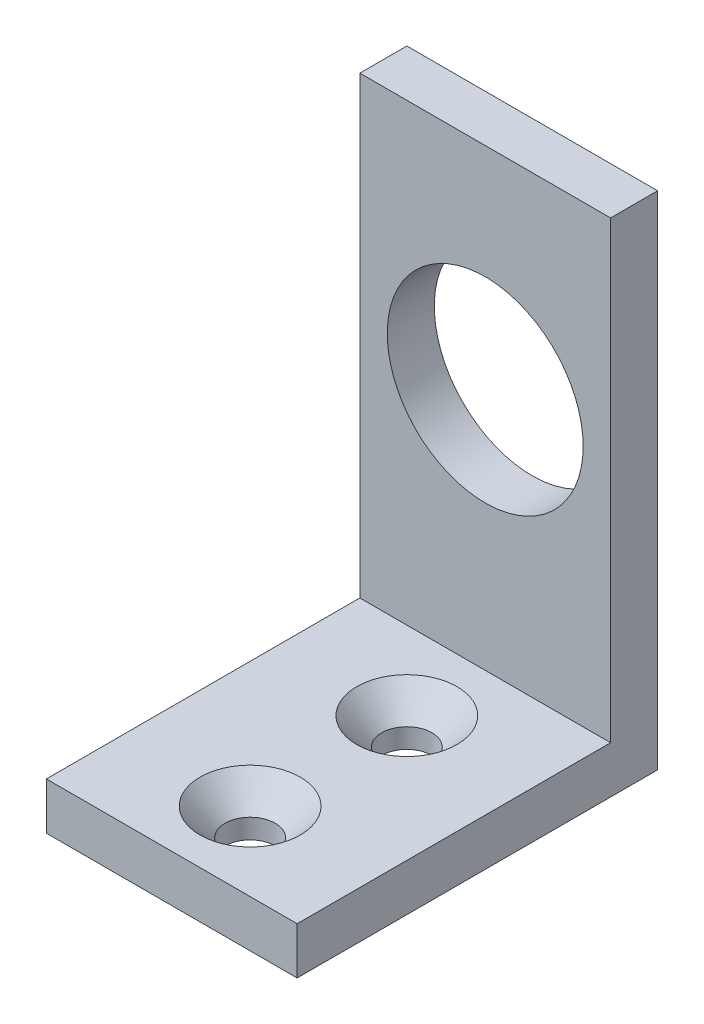
ISO-10303-21;
HEADER;
FILE_DESCRIPTION(('STEP AP214'),'2;1');
FILE_NAME('part.step','',(''),(''),'','','');
FILE_SCHEMA(('AUTOMOTIVE_DESIGN { 1 0 10303 214 1 1 1 1 }'));
ENDSEC;
DATA;
#1=APPLICATION_CONTEXT('core data for automotive mechanical design processes');
#2=APPLICATION_PROTOCOL_DEFINITION('international standard','automotive_design',2000,#1);
#3=PRODUCT_CONTEXT('',#1,'mechanical');
#4=PRODUCT('Part','Part','',(#3));
#5=PRODUCT_RELATED_PRODUCT_CATEGORY('part','',(#4));
#6=PRODUCT_DEFINITION_FORMATION('','',#4);
#7=PRODUCT_DEFINITION_CONTEXT('part definition',#1,'design');
#8=PRODUCT_DEFINITION('design','',#6,#7);
#9=PRODUCT_DEFINITION_SHAPE('','',#8);
#10=(LENGTH_UNIT() NAMED_UNIT(*) SI_UNIT(.MILLI.,.METRE.));
#11=(NAMED_UNIT(*) PLANE_ANGLE_UNIT() SI_UNIT($,.RADIAN.));
#12=(NAMED_UNIT(*) SI_UNIT($,.STERADIAN.) SOLID_ANGLE_UNIT());
#13=UNCERTAINTY_MEASURE_WITH_UNIT(LENGTH_MEASURE(1.E-05),#10,'distance_accuracy_value','');
#14=(GEOMETRIC_REPRESENTATION_CONTEXT(3) GLOBAL_UNCERTAINTY_ASSIGNED_CONTEXT((#13)) GLOBAL_UNIT_ASSIGNED_CONTEXT((#10,
#11,#12)) REPRESENTATION_CONTEXT('',''));
#15=CARTESIAN_POINT('',(0.,0.,0.));
#16=DIRECTION('',(0.,0.,1.));
#17=DIRECTION('',(1.,0.,0.));
#18=AXIS2_PLACEMENT_3D('',#15,#16,#17);
#19=CARTESIAN_POINT('',(16.,0.,-23.));
#20=DIRECTION('',(0.,0.,-1.));
#21=DIRECTION('',(-1.,0.,0.));
#22=AXIS2_PLACEMENT_3D('',#19,#20,#21);
#23=PLANE('',#22);
#24=CARTESIAN_POINT('',(7.99999999999999,15.5,-23.));
#25=DIRECTION('',(0.,0.,1.));
#26=DIRECTION('',(1.,0.,0.));
#27=AXIS2_PLACEMENT_3D('',#24,#25,#26);
#28=CIRCLE('',#27,6.25);
#29=CARTESIAN_POINT('',(14.25,15.5,-23.));
#30=VERTEX_POINT('',#29);
#31=EDGE_CURVE('E194',#30,#30,#28,.T.);
#32=ORIENTED_EDGE('',*,*,#31,.T.);
#33=EDGE_LOOP('',(#32));
#34=FACE_BOUND('',#33,.T.);
#35=DIRECTION('',(0.,-1.,0.));
#36=VECTOR('',#35,1.);
#37=CARTESIAN_POINT('',(0.,0.,-23.));
#38=LINE('',#37,#36);
#39=CARTESIAN_POINT('',(0.,29.,-23.));
#40=VERTEX_POINT('',#39);
#41=CARTESIAN_POINT('',(0.,-3.,-23.));
#42=VERTEX_POINT('',#41);
#43=EDGE_CURVE('E129',#40,#42,#38,.T.);
#44=ORIENTED_EDGE('',*,*,#43,.F.);
#45=DIRECTION('',(-1.,0.,0.));
#46=VECTOR('',#45,1.);
#47=CARTESIAN_POINT('',(16.,29.,-23.));
#48=LINE('',#47,#46);
#49=CARTESIAN_POINT('',(16.,29.,-23.));
#50=VERTEX_POINT('',#49);
#51=EDGE_CURVE('E11',#50,#40,#48,.T.);
#52=ORIENTED_EDGE('',*,*,#51,.F.);
#53=DIRECTION('',(0.,-1.,0.));
#54=VECTOR('',#53,1.);
#55=CARTESIAN_POINT('',(16.,0.,-23.));
#56=LINE('',#55,#54);
#57=CARTESIAN_POINT('',(16.,-3.,-23.));
#58=VERTEX_POINT('',#57);
#59=EDGE_CURVE('E148',#50,#58,#56,.T.);
#60=ORIENTED_EDGE('',*,*,#59,.T.);
#61=DIRECTION('',(-1.,0.,0.));
#62=VECTOR('',#61,1.);
#63=CARTESIAN_POINT('',(16.,-3.,-23.));
#64=LINE('',#63,#62);
#65=EDGE_CURVE('E86',#58,#42,#64,.T.);
#66=ORIENTED_EDGE('',*,*,#65,.T.);
#67=EDGE_LOOP('',(#44,#52,#60,#66));
#68=FACE_BOUND('',#67,.T.);
#69=ADVANCED_FACE('F41',(#34,#68),#23,.T.);
#70=CARTESIAN_POINT('',(16.,29.,0.));
#71=DIRECTION('',(0.,-1.,0.));
#72=DIRECTION('',(0.,0.,-1.));
#73=AXIS2_PLACEMENT_3D('',#70,#71,#72);
#74=PLANE('',#73);
#75=DIRECTION('',(0.,0.,1.));
#76=VECTOR('',#75,1.);
#77=CARTESIAN_POINT('',(0.,29.,0.));
#78=LINE('',#77,#76);
#79=CARTESIAN_POINT('',(0.,29.,-20.));
#80=VERTEX_POINT('',#79);
#81=EDGE_CURVE('E133',#40,#80,#78,.T.);
#82=ORIENTED_EDGE('',*,*,#81,.T.);
#83=DIRECTION('',(-1.,0.,0.));
#84=VECTOR('',#83,1.);
#85=CARTESIAN_POINT('',(16.,29.,-20.));
#86=LINE('',#85,#84);
#87=CARTESIAN_POINT('',(16.,29.,-20.));
#88=VERTEX_POINT('',#87);
#89=EDGE_CURVE('E50',#88,#80,#86,.T.);
#90=ORIENTED_EDGE('',*,*,#89,.F.);
#91=DIRECTION('',(0.,0.,1.));
#92=VECTOR('',#91,1.);
#93=CARTESIAN_POINT('',(16.,29.,0.));
#94=LINE('',#93,#92);
#95=EDGE_CURVE('E123',#50,#88,#94,.T.);
#96=ORIENTED_EDGE('',*,*,#95,.F.);
#97=ORIENTED_EDGE('',*,*,#51,.T.);
#98=EDGE_LOOP('',(#82,#90,#96,#97));
#99=FACE_BOUND('',#98,.T.);
#100=ADVANCED_FACE('F212',(#99),#74,.F.);
#101=CARTESIAN_POINT('',(16.,0.,-20.));
#102=DIRECTION('',(0.,0.,-1.));
#103=DIRECTION('',(0.,1.,0.));
#104=AXIS2_PLACEMENT_3D('',#101,#102,#103);
#105=PLANE('',#104);
#106=CARTESIAN_POINT('',(7.99999999999999,15.5,-20.));
#107=DIRECTION('',(0.,0.,1.));
#108=DIRECTION('',(1.,0.,0.));
#109=AXIS2_PLACEMENT_3D('',#106,#107,#108);
#110=CIRCLE('',#109,6.25);
#111=CARTESIAN_POINT('',(14.25,15.5,-20.));
#112=VERTEX_POINT('',#111);
#113=EDGE_CURVE('E195',#112,#112,#110,.T.);
#114=ORIENTED_EDGE('',*,*,#113,.F.);
#115=EDGE_LOOP('',(#114));
#116=FACE_BOUND('',#115,.T.);
#117=DIRECTION('',(0.,-1.,0.));
#118=VECTOR('',#117,1.);
#119=CARTESIAN_POINT('',(0.,0.,-20.));
#120=LINE('',#119,#118);
#121=CARTESIAN_POINT('',(0.,0.,-20.));
#122=VERTEX_POINT('',#121);
#123=EDGE_CURVE('E137',#80,#122,#120,.T.);
#124=ORIENTED_EDGE('',*,*,#123,.T.);
#125=DIRECTION('',(-1.,0.,0.));
#126=VECTOR('',#125,1.);
#127=CARTESIAN_POINT('',(16.,0.,-20.));
#128=LINE('',#127,#126);
#129=CARTESIAN_POINT('',(16.,0.,-20.));
#130=VERTEX_POINT('',#129);
#131=EDGE_CURVE('E109',#130,#122,#128,.T.);
#132=ORIENTED_EDGE('',*,*,#131,.F.);
#133=DIRECTION('',(0.,-1.,0.));
#134=VECTOR('',#133,1.);
#135=CARTESIAN_POINT('',(16.,0.,-20.));
#136=LINE('',#135,#134);
#137=EDGE_CURVE('E118',#88,#130,#136,.T.);
#138=ORIENTED_EDGE('',*,*,#137,.F.);
#139=ORIENTED_EDGE('',*,*,#89,.T.);
#140=EDGE_LOOP('',(#124,#132,#138,#139));
#141=FACE_BOUND('',#140,.T.);
#142=ADVANCED_FACE('F159',(#116,#141),#105,.F.);
#143=CARTESIAN_POINT('',(16.,0.,0.));
#144=DIRECTION('',(0.,1.,0.));
#145=DIRECTION('',(0.,0.,1.));
#146=AXIS2_PLACEMENT_3D('',#143,#144,#145);
#147=PLANE('',#146);
#148=CARTESIAN_POINT('',(8.,0.,-5.));
#149=DIRECTION('',(0.,1.,0.));
#150=DIRECTION('',(0.,0.,1.));
#151=AXIS2_PLACEMENT_3D('',#148,#149,#150);
#152=CIRCLE('',#151,3.2);
#153=CARTESIAN_POINT('',(8.,0.,-1.8));
#154=VERTEX_POINT('',#153);
#155=EDGE_CURVE('E190',#154,#154,#152,.T.);
#156=ORIENTED_EDGE('',*,*,#155,.F.);
#157=EDGE_LOOP('',(#156));
#158=FACE_BOUND('',#157,.T.);
#159=CARTESIAN_POINT('',(8.,0.,-15.));
#160=DIRECTION('',(0.,1.,0.));
#161=DIRECTION('',(0.,0.,1.));
#162=AXIS2_PLACEMENT_3D('',#159,#160,#161);
#163=CIRCLE('',#162,3.2);
#164=CARTESIAN_POINT('',(8.,0.,-11.8));
#165=VERTEX_POINT('',#164);
#166=EDGE_CURVE('E178',#165,#165,#163,.T.);
#167=ORIENTED_EDGE('',*,*,#166,.F.);
#168=EDGE_LOOP('',(#167));
#169=FACE_BOUND('',#168,.T.);
#170=DIRECTION('',(0.,0.,-1.));
#171=VECTOR('',#170,1.);
#172=CARTESIAN_POINT('',(0.,0.,0.));
#173=LINE('',#172,#171);
#174=CARTESIAN_POINT('',(0.,0.,0.));
#175=VERTEX_POINT('',#174);
#176=EDGE_CURVE('E107',#175,#122,#173,.T.);
#177=ORIENTED_EDGE('',*,*,#176,.F.);
#178=DIRECTION('',(-1.,0.,0.));
#179=VECTOR('',#178,1.);
#180=CARTESIAN_POINT('',(16.,0.,0.));
#181=LINE('',#180,#179);
#182=CARTESIAN_POINT('',(16.,0.,0.));
#183=VERTEX_POINT('',#182);
#184=EDGE_CURVE('E101',#183,#175,#181,.T.);
#185=ORIENTED_EDGE('',*,*,#184,.F.);
#186=DIRECTION('',(0.,0.,-1.));
#187=VECTOR('',#186,1.);
#188=CARTESIAN_POINT('',(16.,0.,0.));
#189=LINE('',#188,#187);
#190=EDGE_CURVE('E105',#183,#130,#189,.T.);
#191=ORIENTED_EDGE('',*,*,#190,.T.);
#192=ORIENTED_EDGE('',*,*,#131,.T.);
#193=EDGE_LOOP('',(#177,#185,#191,#192));
#194=FACE_BOUND('',#193,.T.);
#195=ADVANCED_FACE('F103',(#158,#169,#194),#147,.T.);
#196=CARTESIAN_POINT('',(16.,0.,0.));
#197=DIRECTION('',(0.,0.,-1.));
#198=DIRECTION('',(0.,1.,0.));
#199=AXIS2_PLACEMENT_3D('',#196,#197,#198);
#200=PLANE('',#199);
#201=DIRECTION('',(0.,-1.,0.));
#202=VECTOR('',#201,1.);
#203=CARTESIAN_POINT('',(0.,0.,0.));
#204=LINE('',#203,#202);
#205=CARTESIAN_POINT('',(0.,-3.,0.));
#206=VERTEX_POINT('',#205);
#207=EDGE_CURVE('E79',#175,#206,#204,.T.);
#208=ORIENTED_EDGE('',*,*,#207,.T.);
#209=DIRECTION('',(-1.,0.,0.));
#210=VECTOR('',#209,1.);
#211=CARTESIAN_POINT('',(16.,-3.,0.));
#212=LINE('',#211,#210);
#213=CARTESIAN_POINT('',(16.,-3.,0.));
#214=VERTEX_POINT('',#213);
#215=EDGE_CURVE('E110',#214,#206,#212,.T.);
#216=ORIENTED_EDGE('',*,*,#215,.F.);
#217=DIRECTION('',(0.,-1.,0.));
#218=VECTOR('',#217,1.);
#219=CARTESIAN_POINT('',(16.,0.,0.));
#220=LINE('',#219,#218);
#221=EDGE_CURVE('E112',#183,#214,#220,.T.);
#222=ORIENTED_EDGE('',*,*,#221,.F.);
#223=ORIENTED_EDGE('',*,*,#184,.T.);
#224=EDGE_LOOP('',(#208,#216,#222,#223));
#225=FACE_BOUND('',#224,.T.);
#226=ADVANCED_FACE('F113',(#225),#200,.F.);
#227=CARTESIAN_POINT('',(16.,-3.,0.));
#228=DIRECTION('',(0.,1.,0.));
#229=DIRECTION('',(0.,0.,1.));
#230=AXIS2_PLACEMENT_3D('',#227,#228,#229);
#231=PLANE('',#230);
#232=CARTESIAN_POINT('',(8.,-3.,-5.));
#233=DIRECTION('',(0.,1.,0.));
#234=DIRECTION('',(0.,0.,1.));
#235=AXIS2_PLACEMENT_3D('',#232,#233,#234);
#236=CIRCLE('',#235,1.6);
#237=CARTESIAN_POINT('',(8.,-3.,-3.4));
#238=VERTEX_POINT('',#237);
#239=EDGE_CURVE('E182',#238,#238,#236,.T.);
#240=ORIENTED_EDGE('',*,*,#239,.T.);
#241=EDGE_LOOP('',(#240));
#242=FACE_BOUND('',#241,.T.);
#243=CARTESIAN_POINT('',(8.,-3.,-15.));
#244=DIRECTION('',(0.,1.,0.));
#245=DIRECTION('',(0.,0.,1.));
#246=AXIS2_PLACEMENT_3D('',#243,#244,#245);
#247=CIRCLE('',#246,1.6);
#248=CARTESIAN_POINT('',(8.,-3.,-13.4));
#249=VERTEX_POINT('',#248);
#250=EDGE_CURVE('E134',#249,#249,#247,.T.);
#251=ORIENTED_EDGE('',*,*,#250,.T.);
#252=EDGE_LOOP('',(#251));
#253=FACE_BOUND('',#252,.T.);
#254=DIRECTION('',(0.,0.,-1.));
#255=VECTOR('',#254,1.);
#256=CARTESIAN_POINT('',(0.,-3.,0.));
#257=LINE('',#256,#255);
#258=EDGE_CURVE('E145',#206,#42,#257,.T.);
#259=ORIENTED_EDGE('',*,*,#258,.T.);
#260=ORIENTED_EDGE('',*,*,#65,.F.);
#261=DIRECTION('',(0.,0.,-1.));
#262=VECTOR('',#261,1.);
#263=CARTESIAN_POINT('',(16.,-3.,0.));
#264=LINE('',#263,#262);
#265=EDGE_CURVE('E58',#214,#58,#264,.T.);
#266=ORIENTED_EDGE('',*,*,#265,.F.);
#267=ORIENTED_EDGE('',*,*,#215,.T.);
#268=EDGE_LOOP('',(#259,#260,#266,#267));
#269=FACE_BOUND('',#268,.T.);
#270=ADVANCED_FACE('F166',(#242,#253,#269),#231,.F.);
#271=CARTESIAN_POINT('',(16.,0.,0.));
#272=DIRECTION('',(1.,0.,0.));
#273=DIRECTION('',(0.,0.,-1.));
#274=AXIS2_PLACEMENT_3D('',#271,#272,#273);
#275=PLANE('',#274);
#276=ORIENTED_EDGE('',*,*,#59,.F.);
#277=ORIENTED_EDGE('',*,*,#95,.T.);
#278=ORIENTED_EDGE('',*,*,#137,.T.);
#279=ORIENTED_EDGE('',*,*,#190,.F.);
#280=ORIENTED_EDGE('',*,*,#221,.T.);
#281=ORIENTED_EDGE('',*,*,#265,.T.);
#282=EDGE_LOOP('',(#276,#277,#278,#279,#280,#281));
#283=FACE_BOUND('',#282,.T.);
#284=ADVANCED_FACE('F116',(#283),#275,.T.);
#285=CARTESIAN_POINT('',(0.,0.,0.));
#286=DIRECTION('',(1.,0.,0.));
#287=DIRECTION('',(0.,0.,-1.));
#288=AXIS2_PLACEMENT_3D('',#285,#286,#287);
#289=PLANE('',#288);
#290=ORIENTED_EDGE('',*,*,#43,.T.);
#291=ORIENTED_EDGE('',*,*,#258,.F.);
#292=ORIENTED_EDGE('',*,*,#207,.F.);
#293=ORIENTED_EDGE('',*,*,#176,.T.);
#294=ORIENTED_EDGE('',*,*,#123,.F.);
#295=ORIENTED_EDGE('',*,*,#81,.F.);
#296=EDGE_LOOP('',(#290,#291,#292,#293,#294,#295));
#297=FACE_BOUND('',#296,.T.);
#298=ADVANCED_FACE('F163',(#297),#289,.F.);
#299=CARTESIAN_POINT('',(8.,0.,-15.));
#300=DIRECTION('',(0.,1.,0.));
#301=DIRECTION('',(0.,0.,1.));
#302=AXIS2_PLACEMENT_3D('',#299,#300,#301);
#303=CYLINDRICAL_SURFACE('',#302,1.6);
#304=ORIENTED_EDGE('',*,*,#250,.F.);
#305=EDGE_LOOP('',(#304));
#306=FACE_BOUND('',#305,.T.);
#307=CARTESIAN_POINT('',(8.,-1.74609360171083,-15.));
#308=DIRECTION('',(0.,1.,0.));
#309=DIRECTION('',(0.,0.,1.));
#310=AXIS2_PLACEMENT_3D('',#307,#308,#309);
#311=CIRCLE('',#310,1.6);
#312=CARTESIAN_POINT('',(8.,-1.74609360171083,-13.4));
#313=VERTEX_POINT('',#312);
#314=EDGE_CURVE('E174',#313,#313,#311,.T.);
#315=ORIENTED_EDGE('',*,*,#314,.T.);
#316=EDGE_LOOP('',(#315));
#317=FACE_BOUND('',#316,.T.);
#318=ADVANCED_FACE('F259',(#306,#317),#303,.F.);
#319=CARTESIAN_POINT('',(8.,0.,-15.));
#320=DIRECTION('',(0.,1.,0.));
#321=DIRECTION('',(0.,0.,1.));
#322=AXIS2_PLACEMENT_3D('',#319,#320,#321);
#323=CONICAL_SURFACE('',#322,3.2,0.741764932097591);
#324=ORIENTED_EDGE('',*,*,#314,.F.);
#325=EDGE_LOOP('',(#324));
#326=FACE_BOUND('',#325,.T.);
#327=ORIENTED_EDGE('',*,*,#166,.T.);
#328=EDGE_LOOP('',(#327));
#329=FACE_BOUND('',#328,.T.);
#330=ADVANCED_FACE('F280',(#326,#329),#323,.F.);
#331=CARTESIAN_POINT('',(8.,0.,-5.));
#332=DIRECTION('',(0.,1.,0.));
#333=DIRECTION('',(0.,0.,1.));
#334=AXIS2_PLACEMENT_3D('',#331,#332,#333);
#335=CYLINDRICAL_SURFACE('',#334,1.6);
#336=ORIENTED_EDGE('',*,*,#239,.F.);
#337=EDGE_LOOP('',(#336));
#338=FACE_BOUND('',#337,.T.);
#339=CARTESIAN_POINT('',(8.,-1.74609360171083,-5.));
#340=DIRECTION('',(0.,1.,0.));
#341=DIRECTION('',(0.,0.,1.));
#342=AXIS2_PLACEMENT_3D('',#339,#340,#341);
#343=CIRCLE('',#342,1.6);
#344=CARTESIAN_POINT('',(8.,-1.74609360171083,-3.4));
#345=VERTEX_POINT('',#344);
#346=EDGE_CURVE('E186',#345,#345,#343,.T.);
#347=ORIENTED_EDGE('',*,*,#346,.T.);
#348=EDGE_LOOP('',(#347));
#349=FACE_BOUND('',#348,.T.);
#350=ADVANCED_FACE('F290',(#338,#349),#335,.F.);
#351=CARTESIAN_POINT('',(8.,0.,-5.));
#352=DIRECTION('',(0.,1.,0.));
#353=DIRECTION('',(0.,0.,1.));
#354=AXIS2_PLACEMENT_3D('',#351,#352,#353);
#355=CONICAL_SURFACE('',#354,3.2,0.741764932097591);
#356=ORIENTED_EDGE('',*,*,#346,.F.);
#357=EDGE_LOOP('',(#356));
#358=FACE_BOUND('',#357,.T.);
#359=ORIENTED_EDGE('',*,*,#155,.T.);
#360=EDGE_LOOP('',(#359));
#361=FACE_BOUND('',#360,.T.);
#362=ADVANCED_FACE('F207',(#358,#361),#355,.F.);
#363=CARTESIAN_POINT('',(7.99999999999999,15.5,-23.));
#364=DIRECTION('',(0.,0.,1.));
#365=DIRECTION('',(1.,0.,0.));
#366=AXIS2_PLACEMENT_3D('',#363,#364,#365);
#367=CYLINDRICAL_SURFACE('',#366,6.25);
#368=ORIENTED_EDGE('',*,*,#31,.F.);
#369=EDGE_LOOP('',(#368));
#370=FACE_BOUND('',#369,.T.);
#371=ORIENTED_EDGE('',*,*,#113,.T.);
#372=EDGE_LOOP('',(#371));
#373=FACE_BOUND('',#372,.T.);
#374=ADVANCED_FACE('F204',(#370,#373),#367,.F.);
#375=CLOSED_SHELL('',(#69,#100,#142,#195,#226,#270,#284,#298,#318,#330,#350,#362,#374));
#376=MANIFOLD_SOLID_BREP('B2',#375);
#377=ADVANCED_BREP_SHAPE_REPRESENTATION('',(#18,#376),#14);
#378=SHAPE_DEFINITION_REPRESENTATION(#9,#377);
ENDSEC;
END-ISO-10303-21;
